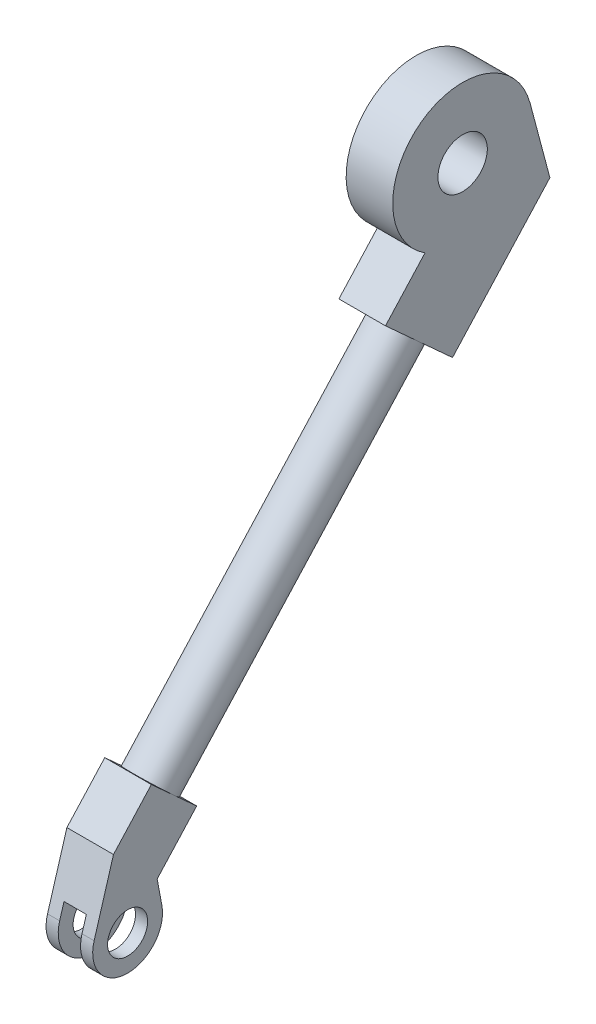
ISO-10303-21;
HEADER;
FILE_DESCRIPTION(('STEP AP214'),'2;1');
FILE_NAME('part.step','',(''),(''),'','','');
FILE_SCHEMA(('AUTOMOTIVE_DESIGN { 1 0 10303 214 1 1 1 1 }'));
ENDSEC;
DATA;
#1=APPLICATION_CONTEXT('core data for automotive mechanical design processes');
#2=APPLICATION_PROTOCOL_DEFINITION('international standard','automotive_design',2000,#1);
#3=PRODUCT_CONTEXT('',#1,'mechanical');
#4=PRODUCT('Part','Part','',(#3));
#5=PRODUCT_RELATED_PRODUCT_CATEGORY('part','',(#4));
#6=PRODUCT_DEFINITION_FORMATION('','',#4);
#7=PRODUCT_DEFINITION_CONTEXT('part definition',#1,'design');
#8=PRODUCT_DEFINITION('design','',#6,#7);
#9=PRODUCT_DEFINITION_SHAPE('','',#8);
#10=(LENGTH_UNIT() NAMED_UNIT(*) SI_UNIT(.MILLI.,.METRE.));
#11=(NAMED_UNIT(*) PLANE_ANGLE_UNIT() SI_UNIT($,.RADIAN.));
#12=(NAMED_UNIT(*) SI_UNIT($,.STERADIAN.) SOLID_ANGLE_UNIT());
#13=UNCERTAINTY_MEASURE_WITH_UNIT(LENGTH_MEASURE(1.E-05),#10,'distance_accuracy_value','');
#14=(GEOMETRIC_REPRESENTATION_CONTEXT(3) GLOBAL_UNCERTAINTY_ASSIGNED_CONTEXT((#13)) GLOBAL_UNIT_ASSIGNED_CONTEXT((#10,
#11,#12)) REPRESENTATION_CONTEXT('',''));
#15=CARTESIAN_POINT('',(0.,0.,0.));
#16=DIRECTION('',(0.,0.,1.));
#17=DIRECTION('',(1.,0.,0.));
#18=AXIS2_PLACEMENT_3D('',#15,#16,#17);
#19=CARTESIAN_POINT('',(22.2296088901351,-53.5689012029136,35.9474329240921));
#20=DIRECTION('',(-1.,0.,0.));
#21=DIRECTION('',(0.,0.,1.));
#22=AXIS2_PLACEMENT_3D('',#19,#20,#21);
#23=CYLINDRICAL_SURFACE('',#22,3.74831407447016);
#24=DIRECTION('',(-1.,0.,0.));
#25=VECTOR('',#24,1.);
#26=CARTESIAN_POINT('',(22.2296088901351,-52.8822305104501,32.2625527685127));
#27=LINE('',#26,#25);
#28=CARTESIAN_POINT('',(-1.19519052838327,-52.8822305104501,32.2625527685127));
#29=VERTEX_POINT('',#28);
#30=CARTESIAN_POINT('',(-2.49519052838327,-52.8822305104501,32.2625527685127));
#31=VERTEX_POINT('',#30);
#32=EDGE_CURVE('E226',#29,#31,#27,.T.);
#33=ORIENTED_EDGE('',*,*,#32,.F.);
#34=CARTESIAN_POINT('',(-1.19519052838327,-53.5689012029136,35.9474329240921));
#35=DIRECTION('',(1.,0.,0.));
#36=DIRECTION('',(0.,0.,-1.));
#37=AXIS2_PLACEMENT_3D('',#34,#35,#36);
#38=CIRCLE('',#37,3.74831407447016);
#39=CARTESIAN_POINT('',(-1.19519052838327,-52.4995828119552,39.5399830740036));
#40=VERTEX_POINT('',#39);
#41=EDGE_CURVE('E187',#29,#40,#38,.F.);
#42=ORIENTED_EDGE('',*,*,#41,.T.);
#43=DIRECTION('',(-1.,0.,0.));
#44=VECTOR('',#43,1.);
#45=CARTESIAN_POINT('',(22.2296088901351,-52.4995828119552,39.5399830740036));
#46=LINE('',#45,#44);
#47=CARTESIAN_POINT('',(-2.49519052838327,-52.4995828119552,39.5399830740036));
#48=VERTEX_POINT('',#47);
#49=EDGE_CURVE('E224',#40,#48,#46,.T.);
#50=ORIENTED_EDGE('',*,*,#49,.T.);
#51=CARTESIAN_POINT('',(-2.49519052838327,-53.5689012029136,35.9474329240921));
#52=DIRECTION('',(-1.,0.,0.));
#53=DIRECTION('',(0.,0.,1.));
#54=AXIS2_PLACEMENT_3D('',#51,#52,#53);
#55=CIRCLE('',#54,3.74831407447016);
#56=EDGE_CURVE('E205',#31,#48,#55,.T.);
#57=ORIENTED_EDGE('',*,*,#56,.F.);
#58=EDGE_LOOP('',(#33,#42,#50,#57));
#59=FACE_BOUND('',#58,.T.);
#60=ADVANCED_FACE('F36',(#59),#23,.T.);
#61=CARTESIAN_POINT('',(22.2296088901351,-50.1386202900982,32.7738195262678));
#62=DIRECTION('',(0.,0.183194545286503,-0.983076679907153));
#63=DIRECTION('',(0.,0.983076679907153,0.183194545286503));
#64=AXIS2_PLACEMENT_3D('',#61,#62,#63);
#65=PLANE('',#64);
#66=DIRECTION('',(1.,0.,0.));
#67=VECTOR('',#66,1.);
#68=CARTESIAN_POINT('',(-1.19519052838327,-51.2759541564758,32.5618794357861));
#69=LINE('',#68,#67);
#70=CARTESIAN_POINT('',(-1.19519052838327,-51.2759541564758,32.5618794357861));
#71=VERTEX_POINT('',#70);
#72=CARTESIAN_POINT('',(1.20480947161673,-51.2759541564758,32.5618794357861));
#73=VERTEX_POINT('',#72);
#74=EDGE_CURVE('E155',#71,#73,#69,.T.);
#75=ORIENTED_EDGE('',*,*,#74,.F.);
#76=DIRECTION('',(0.,-0.983076679907153,-0.183194545286503));
#77=VECTOR('',#76,1.);
#78=CARTESIAN_POINT('',(-1.19519052838327,-50.1386202900982,32.7738195262678));
#79=LINE('',#78,#77);
#80=EDGE_CURVE('E166',#71,#29,#79,.T.);
#81=ORIENTED_EDGE('',*,*,#80,.T.);
#82=ORIENTED_EDGE('',*,*,#32,.T.);
#83=DIRECTION('',(0.,-0.983076679907153,-0.183194545286503));
#84=VECTOR('',#83,1.);
#85=CARTESIAN_POINT('',(-2.49519052838327,-50.1386202900982,32.7738195262678));
#86=LINE('',#85,#84);
#87=CARTESIAN_POINT('',(-2.49519052838327,-50.1386202900982,32.7738195262678));
#88=VERTEX_POINT('',#87);
#89=EDGE_CURVE('E221',#88,#31,#86,.T.);
#90=ORIENTED_EDGE('',*,*,#89,.F.);
#91=DIRECTION('',(-1.,0.,0.));
#92=VECTOR('',#91,1.);
#93=CARTESIAN_POINT('',(22.2296088901351,-50.1386202900982,32.7738195262678));
#94=LINE('',#93,#92);
#95=CARTESIAN_POINT('',(2.50480947161673,-50.1386202900982,32.7738195262678));
#96=VERTEX_POINT('',#95);
#97=EDGE_CURVE('E227',#96,#88,#94,.T.);
#98=ORIENTED_EDGE('',*,*,#97,.F.);
#99=DIRECTION('',(0.,0.983076679907153,0.183194545286503));
#100=VECTOR('',#99,1.);
#101=CARTESIAN_POINT('',(2.50480947161673,-50.1386202900982,32.7738195262678));
#102=LINE('',#101,#100);
#103=CARTESIAN_POINT('',(2.50480947161673,-52.8822305104501,32.2625527685127));
#104=VERTEX_POINT('',#103);
#105=EDGE_CURVE('E200',#104,#96,#102,.T.);
#106=ORIENTED_EDGE('',*,*,#105,.F.);
#107=CARTESIAN_POINT('',(1.20480947161673,-52.8822305104501,32.2625527685127));
#108=VERTEX_POINT('',#107);
#109=EDGE_CURVE('E177',#104,#108,#27,.T.);
#110=ORIENTED_EDGE('',*,*,#109,.T.);
#111=DIRECTION('',(0.,-0.983076679907153,-0.183194545286503));
#112=VECTOR('',#111,1.);
#113=CARTESIAN_POINT('',(1.20480947161673,-50.1386202900982,32.7738195262678));
#114=LINE('',#113,#112);
#115=EDGE_CURVE('E170',#73,#108,#114,.T.);
#116=ORIENTED_EDGE('',*,*,#115,.F.);
#117=EDGE_LOOP('',(#75,#81,#82,#90,#98,#106,#110,#116));
#118=FACE_BOUND('',#117,.T.);
#119=ADVANCED_FACE('F174',(#118),#65,.T.);
#120=CARTESIAN_POINT('',(22.2296088901351,-52.4995828119552,39.5399830740036));
#121=DIRECTION('',(0.,0.2852798270672,0.958444270820431));
#122=DIRECTION('',(0.,-0.958444270820431,0.2852798270672));
#123=AXIS2_PLACEMENT_3D('',#120,#121,#122);
#124=PLANE('',#123);
#125=ORIENTED_EDGE('',*,*,#49,.F.);
#126=DIRECTION('',(0.,0.958444270820431,-0.2852798270672));
#127=VECTOR('',#126,1.);
#128=CARTESIAN_POINT('',(-1.19519052838327,-52.4995828119552,39.5399830740036));
#129=LINE('',#128,#127);
#130=CARTESIAN_POINT('',(-1.19519052838327,-50.9335540368994,39.0738564230009));
#131=VERTEX_POINT('',#130);
#132=EDGE_CURVE('E181',#40,#131,#129,.T.);
#133=ORIENTED_EDGE('',*,*,#132,.T.);
#134=DIRECTION('',(1.,0.,0.));
#135=VECTOR('',#134,1.);
#136=CARTESIAN_POINT('',(-1.19519052838327,-50.9335540368994,39.0738564230009));
#137=LINE('',#136,#135);
#138=CARTESIAN_POINT('',(1.20480947161673,-50.9335540368994,39.0738564230009));
#139=VERTEX_POINT('',#138);
#140=EDGE_CURVE('E11',#139,#131,#137,.F.);
#141=ORIENTED_EDGE('',*,*,#140,.F.);
#142=DIRECTION('',(0.,0.958444270820431,-0.2852798270672));
#143=VECTOR('',#142,1.);
#144=CARTESIAN_POINT('',(1.20480947161673,-52.4995828119552,39.5399830740036));
#145=LINE('',#144,#143);
#146=CARTESIAN_POINT('',(1.20480947161673,-52.4995828119552,39.5399830740036));
#147=VERTEX_POINT('',#146);
#148=EDGE_CURVE('E171',#147,#139,#145,.T.);
#149=ORIENTED_EDGE('',*,*,#148,.F.);
#150=CARTESIAN_POINT('',(2.50480947161673,-52.4995828119552,39.5399830740036));
#151=VERTEX_POINT('',#150);
#152=EDGE_CURVE('E236',#151,#147,#46,.T.);
#153=ORIENTED_EDGE('',*,*,#152,.F.);
#154=DIRECTION('',(0.,-0.958444270820431,0.2852798270672));
#155=VECTOR('',#154,1.);
#156=CARTESIAN_POINT('',(2.50480947161673,-52.4995828119552,39.5399830740036));
#157=LINE('',#156,#155);
#158=CARTESIAN_POINT('',(2.50480947161673,-45.5215924580548,37.4629923276003));
#159=VERTEX_POINT('',#158);
#160=EDGE_CURVE('E204',#159,#151,#157,.T.);
#161=ORIENTED_EDGE('',*,*,#160,.F.);
#162=DIRECTION('',(-1.,0.,0.));
#163=VECTOR('',#162,1.);
#164=CARTESIAN_POINT('',(22.2296088901351,-45.5215924580548,37.4629923276003));
#165=LINE('',#164,#163);
#166=CARTESIAN_POINT('',(-2.49519052838327,-45.5215924580548,37.4629923276003));
#167=VERTEX_POINT('',#166);
#168=EDGE_CURVE('E234',#159,#167,#165,.T.);
#169=ORIENTED_EDGE('',*,*,#168,.T.);
#170=DIRECTION('',(0.,0.958444270820432,-0.2852798270672));
#171=VECTOR('',#170,1.);
#172=CARTESIAN_POINT('',(-2.49519052838327,-52.4995828119552,39.5399830740036));
#173=LINE('',#172,#171);
#174=EDGE_CURVE('E208',#48,#167,#173,.T.);
#175=ORIENTED_EDGE('',*,*,#174,.F.);
#176=EDGE_LOOP('',(#125,#133,#141,#149,#153,#161,#169,#175));
#177=FACE_BOUND('',#176,.T.);
#178=ADVANCED_FACE('F306',(#177),#124,.T.);
#179=CARTESIAN_POINT('',(-2.49519052838328,-53.5689012029136,35.9474329240921));
#180=DIRECTION('',(1.,0.,0.));
#181=DIRECTION('',(0.,0.,-1.));
#182=AXIS2_PLACEMENT_3D('',#179,#180,#181);
#183=CYLINDRICAL_SURFACE('',#182,2.15);
#184=CARTESIAN_POINT('',(-2.49519052838328,-53.5689012029136,35.9474329240921));
#185=DIRECTION('',(1.,0.,0.));
#186=DIRECTION('',(0.,0.,-1.));
#187=AXIS2_PLACEMENT_3D('',#184,#185,#186);
#188=CIRCLE('',#187,2.15);
#189=CARTESIAN_POINT('',(-2.49519052838328,-53.5689012029136,33.7974329240921));
#190=VERTEX_POINT('',#189);
#191=EDGE_CURVE('E165',#190,#190,#188,.T.);
#192=ORIENTED_EDGE('',*,*,#191,.F.);
#193=EDGE_LOOP('',(#192));
#194=FACE_BOUND('',#193,.T.);
#195=CARTESIAN_POINT('',(-1.19519052838327,-53.5689012029136,35.9474329240921));
#196=DIRECTION('',(1.,0.,0.));
#197=DIRECTION('',(0.,0.,-1.));
#198=AXIS2_PLACEMENT_3D('',#195,#196,#197);
#199=CIRCLE('',#198,2.15);
#200=CARTESIAN_POINT('',(-1.19519052838327,-53.5689012029136,33.7974329240921));
#201=VERTEX_POINT('',#200);
#202=EDGE_CURVE('E178',#201,#201,#199,.F.);
#203=ORIENTED_EDGE('',*,*,#202,.F.);
#204=EDGE_LOOP('',(#203));
#205=FACE_BOUND('',#204,.T.);
#206=ADVANCED_FACE('F361',(#194,#205),#183,.F.);
#207=CARTESIAN_POINT('',(28.7662993403489,-10.9857635242249,8.27281408842802));
#208=DIRECTION('',(0.,-0.739771840015449,0.672857804235157));
#209=DIRECTION('',(0.,-0.672857804235157,-0.739771840015449));
#210=AXIS2_PLACEMENT_3D('',#207,#208,#209);
#211=PLANE('',#210);
#212=CARTESIAN_POINT('',(0.00480947161672976,-14.2569473646599,4.67631914783921));
#213=DIRECTION('',(0.,-0.739771840015449,0.672857804235157));
#214=DIRECTION('',(0.,-0.672857804235157,-0.739771840015449));
#215=AXIS2_PLACEMENT_3D('',#212,#213,#214);
#216=CIRCLE('',#215,2.5);
#217=CARTESIAN_POINT('',(2.50480947161673,-14.2569473646599,4.67631914783921));
#218=VERTEX_POINT('',#217);
#219=CARTESIAN_POINT('',(-2.49519052838327,-14.2569473646599,4.67631914783921));
#220=VERTEX_POINT('',#219);
#221=EDGE_CURVE('E240',#218,#220,#216,.T.);
#222=ORIENTED_EDGE('',*,*,#221,.F.);
#223=DIRECTION('',(0.,-0.672857804235157,-0.739771840015449));
#224=VECTOR('',#223,1.);
#225=CARTESIAN_POINT('',(2.50480947161673,-10.9857635242249,8.27281408842802));
#226=LINE('',#225,#224);
#227=CARTESIAN_POINT('',(2.50480947161673,-10.9857635242249,8.27281408842802));
#228=VERTEX_POINT('',#227);
#229=EDGE_CURVE('E245',#228,#218,#226,.T.);
#230=ORIENTED_EDGE('',*,*,#229,.F.);
#231=DIRECTION('',(-1.,0.,0.));
#232=VECTOR('',#231,1.);
#233=CARTESIAN_POINT('',(28.7662993403489,-10.9857635242249,8.27281408842802));
#234=LINE('',#233,#232);
#235=CARTESIAN_POINT('',(-2.49519052838327,-10.9857635242249,8.27281408842802));
#236=VERTEX_POINT('',#235);
#237=EDGE_CURVE('E272',#228,#236,#234,.T.);
#238=ORIENTED_EDGE('',*,*,#237,.T.);
#239=DIRECTION('',(0.,0.672857804235157,0.739771840015449));
#240=VECTOR('',#239,1.);
#241=CARTESIAN_POINT('',(-2.49519052838327,-10.9857635242249,8.27281408842802));
#242=LINE('',#241,#240);
#243=EDGE_CURVE('E256',#220,#236,#242,.T.);
#244=ORIENTED_EDGE('',*,*,#243,.F.);
#245=EDGE_LOOP('',(#222,#230,#238,#244));
#246=FACE_BOUND('',#245,.T.);
#247=ADVANCED_FACE('F380',(#246),#211,.T.);
#248=CARTESIAN_POINT('',(23.7180129072131,-0.00178283958147951,-0.00430345347766719));
#249=DIRECTION('',(-1.,0.,0.));
#250=DIRECTION('',(0.,0.,1.));
#251=AXIS2_PLACEMENT_3D('',#248,#249,#250);
#252=CYLINDRICAL_SURFACE('',#251,7.49999999999999);
#253=DIRECTION('',(-1.,0.,0.));
#254=VECTOR('',#253,1.);
#255=CARTESIAN_POINT('',(28.7662993403489,1.924750693338,-7.25264592238299));
#256=LINE('',#255,#254);
#257=CARTESIAN_POINT('',(2.50480947161673,1.924750693338,-7.252645922383));
#258=VERTEX_POINT('',#257);
#259=CARTESIAN_POINT('',(-2.49519052838327,1.924750693338,-7.25264592238299));
#260=VERTEX_POINT('',#259);
#261=EDGE_CURVE('E267',#258,#260,#256,.T.);
#262=ORIENTED_EDGE('',*,*,#261,.T.);
#263=CARTESIAN_POINT('',(-2.49519052838327,-0.00178283958147951,-0.00430345347766719));
#264=DIRECTION('',(-1.,0.,0.));
#265=DIRECTION('',(0.,0.,1.));
#266=AXIS2_PLACEMENT_3D('',#263,#264,#265);
#267=CIRCLE('',#266,7.49999999999999);
#268=CARTESIAN_POINT('',(-2.49519052838327,-6.32310094675498,4.03189988479957));
#269=VERTEX_POINT('',#268);
#270=EDGE_CURVE('E286',#269,#260,#267,.T.);
#271=ORIENTED_EDGE('',*,*,#270,.F.);
#272=DIRECTION('',(-1.,0.,0.));
#273=VECTOR('',#272,1.);
#274=CARTESIAN_POINT('',(28.7662993403489,-6.32310094675498,4.03189988479957));
#275=LINE('',#274,#273);
#276=CARTESIAN_POINT('',(2.50480947161673,-6.32310094675498,4.03189988479957));
#277=VERTEX_POINT('',#276);
#278=EDGE_CURVE('E270',#277,#269,#275,.T.);
#279=ORIENTED_EDGE('',*,*,#278,.F.);
#280=CARTESIAN_POINT('',(2.50480947161673,-0.00178283958147951,-0.00430345347766719));
#281=DIRECTION('',(-1.,0.,0.));
#282=DIRECTION('',(0.,0.,1.));
#283=AXIS2_PLACEMENT_3D('',#280,#281,#282);
#284=CIRCLE('',#283,7.49999999999999);
#285=EDGE_CURVE('E280',#258,#277,#284,.F.);
#286=ORIENTED_EDGE('',*,*,#285,.F.);
#287=EDGE_LOOP('',(#262,#271,#279,#286));
#288=FACE_BOUND('',#287,.T.);
#289=ADVANCED_FACE('F38',(#288),#252,.T.);
#290=CARTESIAN_POINT('',(-2.49519052838327,-0.00178283958147951,-0.00430345347766719));
#291=DIRECTION('',(-1.,0.,0.));
#292=DIRECTION('',(0.,0.,1.));
#293=AXIS2_PLACEMENT_3D('',#290,#291,#292);
#294=PLANE('',#293);
#295=ORIENTED_EDGE('',*,*,#270,.T.);
#296=DIRECTION('',(0.,-0.966445662520712,-0.256871137722598));
#297=VECTOR('',#296,1.);
#298=CARTESIAN_POINT('',(-2.49519052838327,-3.89857031933739,-8.8004236732276));
#299=LINE('',#298,#297);
#300=CARTESIAN_POINT('',(-2.49519052838327,-6.03964800920959,-9.36949970458509));
#301=VERTEX_POINT('',#300);
#302=EDGE_CURVE('E263',#260,#301,#299,.T.);
#303=ORIENTED_EDGE('',*,*,#302,.T.);
#304=DIRECTION('',(0.,-0.739771840015449,0.672857804235157));
#305=VECTOR('',#304,1.);
#306=CARTESIAN_POINT('',(-2.49519052838327,-17.528131205095,1.0798242072504));
#307=LINE('',#306,#305);
#308=CARTESIAN_POINT('',(-2.49519052838327,-17.528131205095,1.0798242072504));
#309=VERTEX_POINT('',#308);
#310=EDGE_CURVE('E243',#301,#309,#307,.T.);
#311=ORIENTED_EDGE('',*,*,#310,.T.);
#312=EDGE_CURVE('E257',#309,#220,#242,.T.);
#313=ORIENTED_EDGE('',*,*,#312,.T.);
#314=ORIENTED_EDGE('',*,*,#243,.T.);
#315=DIRECTION('',(0.,0.739771840015448,-0.672857804235158));
#316=VECTOR('',#315,1.);
#317=CARTESIAN_POINT('',(-2.49519052838327,-6.32310094675498,4.03189988479957));
#318=LINE('',#317,#316);
#319=EDGE_CURVE('E260',#236,#269,#318,.T.);
#320=ORIENTED_EDGE('',*,*,#319,.T.);
#321=EDGE_LOOP('',(#295,#303,#311,#313,#314,#320));
#322=FACE_BOUND('',#321,.T.);
#323=CARTESIAN_POINT('',(-2.49519052838327,-0.00178283958147951,-0.00430345347766719));
#324=DIRECTION('',(-1.,0.,0.));
#325=DIRECTION('',(0.,0.,1.));
#326=AXIS2_PLACEMENT_3D('',#323,#324,#325);
#327=CIRCLE('',#326,2.65);
#328=CARTESIAN_POINT('',(-2.49519052838327,-0.00178283958147951,2.64569654652233));
#329=VERTEX_POINT('',#328);
#330=EDGE_CURVE('E279',#329,#329,#327,.T.);
#331=ORIENTED_EDGE('',*,*,#330,.F.);
#332=EDGE_LOOP('',(#331));
#333=FACE_BOUND('',#332,.T.);
#334=ADVANCED_FACE('F519',(#322,#333),#294,.T.);
#335=CARTESIAN_POINT('',(23.7180129072131,-0.00178283958147951,-0.00430345347766719));
#336=DIRECTION('',(-1.,0.,0.));
#337=DIRECTION('',(0.,0.,1.));
#338=AXIS2_PLACEMENT_3D('',#335,#336,#337);
#339=CYLINDRICAL_SURFACE('',#338,2.65);
#340=CARTESIAN_POINT('',(2.50480947161673,-0.00178283958147951,-0.00430345347766719));
#341=DIRECTION('',(-1.,0.,0.));
#342=DIRECTION('',(0.,0.,1.));
#343=AXIS2_PLACEMENT_3D('',#340,#341,#342);
#344=CIRCLE('',#343,2.65);
#345=CARTESIAN_POINT('',(2.50480947161673,-0.00178283958147951,2.64569654652233));
#346=VERTEX_POINT('',#345);
#347=EDGE_CURVE('E283',#346,#346,#344,.F.);
#348=ORIENTED_EDGE('',*,*,#347,.T.);
#349=EDGE_LOOP('',(#348));
#350=FACE_BOUND('',#349,.T.);
#351=ORIENTED_EDGE('',*,*,#330,.T.);
#352=EDGE_LOOP('',(#351));
#353=FACE_BOUND('',#352,.T.);
#354=ADVANCED_FACE('F508',(#350,#353),#339,.F.);
#355=CARTESIAN_POINT('',(2.50480947161673,15.025154096032,4.11605765774619));
#356=DIRECTION('',(-1.,0.,0.));
#357=DIRECTION('',(0.,-1.,0.));
#358=AXIS2_PLACEMENT_3D('',#355,#356,#357);
#359=PLANE('',#358);
#360=ORIENTED_EDGE('',*,*,#285,.T.);
#361=DIRECTION('',(0.,-0.739771840015448,0.672857804235158));
#362=VECTOR('',#361,1.);
#363=CARTESIAN_POINT('',(2.50480947161673,-6.32310094675498,4.03189988479957));
#364=LINE('',#363,#362);
#365=EDGE_CURVE('E247',#277,#228,#364,.T.);
#366=ORIENTED_EDGE('',*,*,#365,.T.);
#367=ORIENTED_EDGE('',*,*,#229,.T.);
#368=CARTESIAN_POINT('',(2.50480947161673,-17.528131205095,1.0798242072504));
#369=VERTEX_POINT('',#368);
#370=EDGE_CURVE('E248',#218,#369,#226,.T.);
#371=ORIENTED_EDGE('',*,*,#370,.T.);
#372=DIRECTION('',(0.,0.739771840015449,-0.672857804235157));
#373=VECTOR('',#372,1.);
#374=CARTESIAN_POINT('',(2.50480947161673,-17.528131205095,1.0798242072504));
#375=LINE('',#374,#373);
#376=CARTESIAN_POINT('',(2.50480947161673,-6.03964800920959,-9.36949970458509));
#377=VERTEX_POINT('',#376);
#378=EDGE_CURVE('E253',#369,#377,#375,.T.);
#379=ORIENTED_EDGE('',*,*,#378,.T.);
#380=DIRECTION('',(0.,0.966445662520712,0.256871137722598));
#381=VECTOR('',#380,1.);
#382=CARTESIAN_POINT('',(2.50480947161673,-3.89857031933739,-8.8004236732276));
#383=LINE('',#382,#381);
#384=EDGE_CURVE('E250',#377,#258,#383,.T.);
#385=ORIENTED_EDGE('',*,*,#384,.T.);
#386=EDGE_LOOP('',(#360,#366,#367,#371,#379,#385));
#387=FACE_BOUND('',#386,.T.);
#388=ORIENTED_EDGE('',*,*,#347,.F.);
#389=EDGE_LOOP('',(#388));
#390=FACE_BOUND('',#389,.T.);
#391=ADVANCED_FACE('F497',(#387,#390),#359,.F.);
#392=CARTESIAN_POINT('',(28.7662993403489,-3.89857031933739,-8.8004236732276));
#393=DIRECTION('',(0.,0.256871137722598,-0.966445662520712));
#394=DIRECTION('',(0.,0.966445662520712,0.256871137722598));
#395=AXIS2_PLACEMENT_3D('',#392,#393,#394);
#396=PLANE('',#395);
#397=ORIENTED_EDGE('',*,*,#384,.F.);
#398=DIRECTION('',(-1.,0.,0.));
#399=VECTOR('',#398,1.);
#400=CARTESIAN_POINT('',(28.7662993403489,-6.03964800920959,-9.36949970458509));
#401=LINE('',#400,#399);
#402=EDGE_CURVE('E266',#377,#301,#401,.T.);
#403=ORIENTED_EDGE('',*,*,#402,.T.);
#404=ORIENTED_EDGE('',*,*,#302,.F.);
#405=ORIENTED_EDGE('',*,*,#261,.F.);
#406=EDGE_LOOP('',(#397,#403,#404,#405));
#407=FACE_BOUND('',#406,.T.);
#408=ADVANCED_FACE('F486',(#407),#396,.T.);
#409=CARTESIAN_POINT('',(28.7662993403489,-6.32310094675498,4.03189988479957));
#410=DIRECTION('',(0.,0.672857804235158,0.739771840015448));
#411=DIRECTION('',(0.,-0.739771840015448,0.672857804235158));
#412=AXIS2_PLACEMENT_3D('',#409,#410,#411);
#413=PLANE('',#412);
#414=ORIENTED_EDGE('',*,*,#365,.F.);
#415=ORIENTED_EDGE('',*,*,#278,.T.);
#416=ORIENTED_EDGE('',*,*,#319,.F.);
#417=ORIENTED_EDGE('',*,*,#237,.F.);
#418=EDGE_LOOP('',(#414,#415,#416,#417));
#419=FACE_BOUND('',#418,.T.);
#420=ADVANCED_FACE('F476',(#419),#413,.T.);
#421=EDGE_CURVE('E244',#220,#218,#216,.T.);
#422=ORIENTED_EDGE('',*,*,#421,.F.);
#423=ORIENTED_EDGE('',*,*,#312,.F.);
#424=DIRECTION('',(-1.,0.,0.));
#425=VECTOR('',#424,1.);
#426=CARTESIAN_POINT('',(28.7662993403489,-17.528131205095,1.0798242072504));
#427=LINE('',#426,#425);
#428=EDGE_CURVE('E275',#369,#309,#427,.T.);
#429=ORIENTED_EDGE('',*,*,#428,.F.);
#430=ORIENTED_EDGE('',*,*,#370,.F.);
#431=EDGE_LOOP('',(#422,#423,#429,#430));
#432=FACE_BOUND('',#431,.T.);
#433=ADVANCED_FACE('F465',(#432),#211,.T.);
#434=CARTESIAN_POINT('',(28.7662993403489,-17.528131205095,1.0798242072504));
#435=DIRECTION('',(0.,-0.672857804235157,-0.739771840015449));
#436=DIRECTION('',(0.,0.739771840015449,-0.672857804235157));
#437=AXIS2_PLACEMENT_3D('',#434,#435,#436);
#438=PLANE('',#437);
#439=ORIENTED_EDGE('',*,*,#378,.F.);
#440=ORIENTED_EDGE('',*,*,#428,.T.);
#441=ORIENTED_EDGE('',*,*,#310,.F.);
#442=ORIENTED_EDGE('',*,*,#402,.F.);
#443=EDGE_LOOP('',(#439,#440,#441,#442));
#444=FACE_BOUND('',#443,.T.);
#445=ADVANCED_FACE('F456',(#444),#438,.T.);
#446=CARTESIAN_POINT('',(0.00480947161672976,-47.5466801653552,34.9549203384213));
#447=DIRECTION('',(0.,0.739771840015449,-0.672857804235157));
#448=DIRECTION('',(0.,0.672857804235157,0.739771840015449));
#449=AXIS2_PLACEMENT_3D('',#446,#447,#448);
#450=CYLINDRICAL_SURFACE('',#449,2.5);
#451=CARTESIAN_POINT('',(0.00480947161672976,-43.2189533438287,31.0186461942188));
#452=DIRECTION('',(0.,0.739771840015448,-0.672857804235158));
#453=DIRECTION('',(0.,0.672857804235158,0.739771840015448));
#454=AXIS2_PLACEMENT_3D('',#451,#452,#453);
#455=CIRCLE('',#454,2.5);
#456=CARTESIAN_POINT('',(-2.49519052838327,-43.2189533438287,31.0186461942188));
#457=VERTEX_POINT('',#456);
#458=CARTESIAN_POINT('',(2.50480947161673,-43.2189533438287,31.0186461942188));
#459=VERTEX_POINT('',#458);
#460=EDGE_CURVE('E291',#457,#459,#455,.T.);
#461=ORIENTED_EDGE('',*,*,#460,.T.);
#462=EDGE_CURVE('E44',#459,#457,#455,.T.);
#463=ORIENTED_EDGE('',*,*,#462,.T.);
#464=EDGE_LOOP('',(#461,#463));
#465=FACE_BOUND('',#464,.T.);
#466=ORIENTED_EDGE('',*,*,#221,.T.);
#467=ORIENTED_EDGE('',*,*,#421,.T.);
#468=EDGE_LOOP('',(#466,#467));
#469=FACE_BOUND('',#468,.T.);
#470=ADVANCED_FACE('F327',(#465,#469),#450,.T.);
#471=CARTESIAN_POINT('',(22.2296088901351,-41.0536988821347,33.3992298288991));
#472=DIRECTION('',(0.,0.739771840015448,-0.672857804235158));
#473=DIRECTION('',(0.,0.672857804235158,0.739771840015448));
#474=AXIS2_PLACEMENT_3D('',#471,#472,#473);
#475=PLANE('',#474);
#476=ORIENTED_EDGE('',*,*,#462,.F.);
#477=DIRECTION('',(0.,0.672857804235158,0.739771840015448));
#478=VECTOR('',#477,1.);
#479=CARTESIAN_POINT('',(2.50480947161673,-41.0536988821347,33.3992298288991));
#480=LINE('',#479,#478);
#481=CARTESIAN_POINT('',(2.50480947161673,-45.4780896388408,28.534844411305));
#482=VERTEX_POINT('',#481);
#483=EDGE_CURVE('E59',#482,#459,#480,.T.);
#484=ORIENTED_EDGE('',*,*,#483,.F.);
#485=DIRECTION('',(-1.,0.,0.));
#486=VECTOR('',#485,1.);
#487=CARTESIAN_POINT('',(22.2296088901351,-45.4780896388408,28.534844411305));
#488=LINE('',#487,#486);
#489=CARTESIAN_POINT('',(-2.49519052838327,-45.4780896388408,28.534844411305));
#490=VERTEX_POINT('',#489);
#491=EDGE_CURVE('E229',#482,#490,#488,.T.);
#492=ORIENTED_EDGE('',*,*,#491,.T.);
#493=DIRECTION('',(0.,-0.672857804235158,-0.739771840015448));
#494=VECTOR('',#493,1.);
#495=CARTESIAN_POINT('',(-2.49519052838327,-41.0536988821347,33.3992298288991));
#496=LINE('',#495,#494);
#497=EDGE_CURVE('E214',#457,#490,#496,.T.);
#498=ORIENTED_EDGE('',*,*,#497,.F.);
#499=EDGE_LOOP('',(#476,#484,#492,#498));
#500=FACE_BOUND('',#499,.T.);
#501=ADVANCED_FACE('F324',(#500),#475,.T.);
#502=CARTESIAN_POINT('',(1.20480947161673,-53.5689012029136,35.9474329240921));
#503=DIRECTION('',(1.,0.,0.));
#504=DIRECTION('',(0.,0.,-1.));
#505=AXIS2_PLACEMENT_3D('',#502,#503,#504);
#506=CIRCLE('',#505,3.74831407447016);
#507=EDGE_CURVE('E51',#108,#147,#506,.F.);
#508=ORIENTED_EDGE('',*,*,#507,.F.);
#509=ORIENTED_EDGE('',*,*,#109,.F.);
#510=CARTESIAN_POINT('',(2.50480947161673,-53.5689012029136,35.9474329240921));
#511=DIRECTION('',(-1.,0.,0.));
#512=DIRECTION('',(0.,0.,1.));
#513=AXIS2_PLACEMENT_3D('',#510,#511,#512);
#514=CIRCLE('',#513,3.74831407447016);
#515=EDGE_CURVE('E202',#151,#104,#514,.F.);
#516=ORIENTED_EDGE('',*,*,#515,.F.);
#517=ORIENTED_EDGE('',*,*,#152,.T.);
#518=EDGE_LOOP('',(#508,#509,#516,#517));
#519=FACE_BOUND('',#518,.T.);
#520=ADVANCED_FACE('F342',(#519),#23,.T.);
#521=CARTESIAN_POINT('',(22.2296088901351,-45.4780896388408,28.534844411305));
#522=DIRECTION('',(0.,-0.672857804235156,-0.73977184001545));
#523=DIRECTION('',(0.,0.73977184001545,-0.672857804235156));
#524=AXIS2_PLACEMENT_3D('',#521,#522,#523);
#525=PLANE('',#524);
#526=DIRECTION('',(0.,0.73977184001545,-0.672857804235156));
#527=VECTOR('',#526,1.);
#528=CARTESIAN_POINT('',(2.50480947161673,-45.4780896388408,28.534844411305));
#529=LINE('',#528,#527);
#530=EDGE_CURVE('E198',#96,#482,#529,.T.);
#531=ORIENTED_EDGE('',*,*,#530,.F.);
#532=ORIENTED_EDGE('',*,*,#97,.T.);
#533=DIRECTION('',(0.,-0.73977184001545,0.672857804235156));
#534=VECTOR('',#533,1.);
#535=CARTESIAN_POINT('',(-2.49519052838327,-45.4780896388408,28.534844411305));
#536=LINE('',#535,#534);
#537=EDGE_CURVE('E218',#490,#88,#536,.T.);
#538=ORIENTED_EDGE('',*,*,#537,.F.);
#539=ORIENTED_EDGE('',*,*,#491,.F.);
#540=EDGE_LOOP('',(#531,#532,#538,#539));
#541=FACE_BOUND('',#540,.T.);
#542=ADVANCED_FACE('F320',(#541),#525,.T.);
#543=ORIENTED_EDGE('',*,*,#460,.F.);
#544=CARTESIAN_POINT('',(-2.49519052838327,-41.0536988821347,33.3992298288991));
#545=VERTEX_POINT('',#544);
#546=EDGE_CURVE('E215',#545,#457,#496,.T.);
#547=ORIENTED_EDGE('',*,*,#546,.F.);
#548=DIRECTION('',(-1.,0.,0.));
#549=VECTOR('',#548,1.);
#550=CARTESIAN_POINT('',(22.2296088901351,-41.0536988821347,33.3992298288991));
#551=LINE('',#550,#549);
#552=CARTESIAN_POINT('',(2.50480947161673,-41.0536988821347,33.3992298288991));
#553=VERTEX_POINT('',#552);
#554=EDGE_CURVE('E232',#553,#545,#551,.T.);
#555=ORIENTED_EDGE('',*,*,#554,.F.);
#556=EDGE_CURVE('E196',#459,#553,#480,.T.);
#557=ORIENTED_EDGE('',*,*,#556,.F.);
#558=EDGE_LOOP('',(#543,#547,#555,#557));
#559=FACE_BOUND('',#558,.T.);
#560=ADVANCED_FACE('F331',(#559),#475,.T.);
#561=CARTESIAN_POINT('',(22.2296088901351,-45.5215924580548,37.4629923276003));
#562=DIRECTION('',(0.,0.672857804235157,0.739771840015449));
#563=DIRECTION('',(0.,-0.739771840015449,0.672857804235157));
#564=AXIS2_PLACEMENT_3D('',#561,#562,#563);
#565=PLANE('',#564);
#566=DIRECTION('',(0.,-0.739771840015449,0.672857804235157));
#567=VECTOR('',#566,1.);
#568=CARTESIAN_POINT('',(2.50480947161673,-45.5215924580548,37.4629923276003));
#569=LINE('',#568,#567);
#570=EDGE_CURVE('E194',#553,#159,#569,.T.);
#571=ORIENTED_EDGE('',*,*,#570,.F.);
#572=ORIENTED_EDGE('',*,*,#554,.T.);
#573=DIRECTION('',(0.,0.739771840015449,-0.672857804235157));
#574=VECTOR('',#573,1.);
#575=CARTESIAN_POINT('',(-2.49519052838327,-45.5215924580548,37.4629923276003));
#576=LINE('',#575,#574);
#577=EDGE_CURVE('E211',#167,#545,#576,.T.);
#578=ORIENTED_EDGE('',*,*,#577,.F.);
#579=ORIENTED_EDGE('',*,*,#168,.F.);
#580=EDGE_LOOP('',(#571,#572,#578,#579));
#581=FACE_BOUND('',#580,.T.);
#582=ADVANCED_FACE('F336',(#581),#565,.T.);
#583=CARTESIAN_POINT('',(-2.49519052838327,-53.5689012029136,35.9474329240921));
#584=DIRECTION('',(-1.,0.,0.));
#585=DIRECTION('',(0.,0.,1.));
#586=AXIS2_PLACEMENT_3D('',#583,#584,#585);
#587=PLANE('',#586);
#588=ORIENTED_EDGE('',*,*,#191,.T.);
#589=EDGE_LOOP('',(#588));
#590=FACE_BOUND('',#589,.T.);
#591=ORIENTED_EDGE('',*,*,#546,.T.);
#592=ORIENTED_EDGE('',*,*,#497,.T.);
#593=ORIENTED_EDGE('',*,*,#537,.T.);
#594=ORIENTED_EDGE('',*,*,#89,.T.);
#595=ORIENTED_EDGE('',*,*,#56,.T.);
#596=ORIENTED_EDGE('',*,*,#174,.T.);
#597=ORIENTED_EDGE('',*,*,#577,.T.);
#598=EDGE_LOOP('',(#591,#592,#593,#594,#595,#596,#597));
#599=FACE_BOUND('',#598,.T.);
#600=ADVANCED_FACE('F314',(#590,#599),#587,.T.);
#601=CARTESIAN_POINT('',(2.50480947161673,15.025154096032,4.11605765774619));
#602=DIRECTION('',(-1.,0.,0.));
#603=DIRECTION('',(0.,-1.,0.));
#604=AXIS2_PLACEMENT_3D('',#601,#602,#603);
#605=PLANE('',#604);
#606=CARTESIAN_POINT('',(2.50480947161673,-53.5689012029136,35.9474329240921));
#607=DIRECTION('',(-1.,0.,0.));
#608=DIRECTION('',(0.,0.,1.));
#609=AXIS2_PLACEMENT_3D('',#606,#607,#608);
#610=CIRCLE('',#609,2.15);
#611=CARTESIAN_POINT('',(2.50480947161673,-53.5689012029136,38.0974329240921));
#612=VERTEX_POINT('',#611);
#613=EDGE_CURVE('E193',#612,#612,#610,.T.);
#614=ORIENTED_EDGE('',*,*,#613,.T.);
#615=EDGE_LOOP('',(#614));
#616=FACE_BOUND('',#615,.T.);
#617=ORIENTED_EDGE('',*,*,#483,.T.);
#618=ORIENTED_EDGE('',*,*,#556,.T.);
#619=ORIENTED_EDGE('',*,*,#570,.T.);
#620=ORIENTED_EDGE('',*,*,#160,.T.);
#621=ORIENTED_EDGE('',*,*,#515,.T.);
#622=ORIENTED_EDGE('',*,*,#105,.T.);
#623=ORIENTED_EDGE('',*,*,#530,.T.);
#624=EDGE_LOOP('',(#617,#618,#619,#620,#621,#622,#623));
#625=FACE_BOUND('',#624,.T.);
#626=ADVANCED_FACE('F321',(#616,#625),#605,.F.);
#627=CARTESIAN_POINT('',(1.20480947161673,-53.5689012029136,35.9474329240921));
#628=DIRECTION('',(1.,0.,0.));
#629=DIRECTION('',(0.,0.,-1.));
#630=AXIS2_PLACEMENT_3D('',#627,#628,#629);
#631=CIRCLE('',#630,2.15);
#632=CARTESIAN_POINT('',(1.20480947161673,-53.5689012029136,33.7974329240921));
#633=VERTEX_POINT('',#632);
#634=EDGE_CURVE('E296',#633,#633,#631,.F.);
#635=ORIENTED_EDGE('',*,*,#634,.T.);
#636=EDGE_LOOP('',(#635));
#637=FACE_BOUND('',#636,.T.);
#638=ORIENTED_EDGE('',*,*,#613,.F.);
#639=EDGE_LOOP('',(#638));
#640=FACE_BOUND('',#639,.T.);
#641=ADVANCED_FACE('F374',(#637,#640),#183,.F.);
#642=CARTESIAN_POINT('',(-1.19519052838327,-53.5689012029136,35.9474329240921));
#643=DIRECTION('',(1.,0.,0.));
#644=DIRECTION('',(0.,0.,-1.));
#645=AXIS2_PLACEMENT_3D('',#642,#643,#644);
#646=PLANE('',#645);
#647=CARTESIAN_POINT('',(-1.19519052838327,-53.5689012029136,35.9474329240921));
#648=DIRECTION('',(1.,0.,0.));
#649=DIRECTION('',(0.,0.,-1.));
#650=AXIS2_PLACEMENT_3D('',#647,#648,#649);
#651=CIRCLE('',#650,4.08895812890632);
#652=EDGE_CURVE('E161',#71,#131,#651,.T.);
#653=ORIENTED_EDGE('',*,*,#652,.T.);
#654=ORIENTED_EDGE('',*,*,#132,.F.);
#655=ORIENTED_EDGE('',*,*,#41,.F.);
#656=ORIENTED_EDGE('',*,*,#80,.F.);
#657=EDGE_LOOP('',(#653,#654,#655,#656));
#658=FACE_BOUND('',#657,.T.);
#659=ORIENTED_EDGE('',*,*,#202,.T.);
#660=EDGE_LOOP('',(#659));
#661=FACE_BOUND('',#660,.T.);
#662=ADVANCED_FACE('F302',(#658,#661),#646,.T.);
#663=CARTESIAN_POINT('',(1.20480947161673,-53.5689012029136,35.9474329240921));
#664=DIRECTION('',(1.,0.,0.));
#665=DIRECTION('',(0.,0.,-1.));
#666=AXIS2_PLACEMENT_3D('',#663,#664,#665);
#667=PLANE('',#666);
#668=ORIENTED_EDGE('',*,*,#115,.T.);
#669=ORIENTED_EDGE('',*,*,#507,.T.);
#670=ORIENTED_EDGE('',*,*,#148,.T.);
#671=CARTESIAN_POINT('',(1.20480947161673,-53.5689012029136,35.9474329240921));
#672=DIRECTION('',(1.,0.,0.));
#673=DIRECTION('',(0.,0.,-1.));
#674=AXIS2_PLACEMENT_3D('',#671,#672,#673);
#675=CIRCLE('',#674,4.08895812890632);
#676=EDGE_CURVE('E158',#73,#139,#675,.T.);
#677=ORIENTED_EDGE('',*,*,#676,.F.);
#678=EDGE_LOOP('',(#668,#669,#670,#677));
#679=FACE_BOUND('',#678,.T.);
#680=ORIENTED_EDGE('',*,*,#634,.F.);
#681=EDGE_LOOP('',(#680));
#682=FACE_BOUND('',#681,.T.);
#683=ADVANCED_FACE('F168',(#679,#682),#667,.F.);
#684=CARTESIAN_POINT('',(-1.19519052838327,-53.5689012029136,35.9474329240921));
#685=DIRECTION('',(1.,0.,0.));
#686=DIRECTION('',(0.,0.,-1.));
#687=AXIS2_PLACEMENT_3D('',#684,#685,#686);
#688=CYLINDRICAL_SURFACE('',#687,4.08895812890632);
#689=ORIENTED_EDGE('',*,*,#74,.T.);
#690=ORIENTED_EDGE('',*,*,#676,.T.);
#691=ORIENTED_EDGE('',*,*,#140,.T.);
#692=ORIENTED_EDGE('',*,*,#652,.F.);
#693=EDGE_LOOP('',(#689,#690,#691,#692));
#694=FACE_BOUND('',#693,.T.);
#695=ADVANCED_FACE('F157',(#694),#688,.F.);
#696=CLOSED_SHELL('',(#60,#119,#178,#206,#247,#289,#334,#354,#391,#408,#420,#433,#445,#470,#501,
#520,#542,#560,#582,#600,#626,#641,#662,#683,#695));
#697=MANIFOLD_SOLID_BREP('B2',#696);
#698=ADVANCED_BREP_SHAPE_REPRESENTATION('',(#18,#697),#14);
#699=SHAPE_DEFINITION_REPRESENTATION(#9,#698);
ENDSEC;
END-ISO-10303-21;
